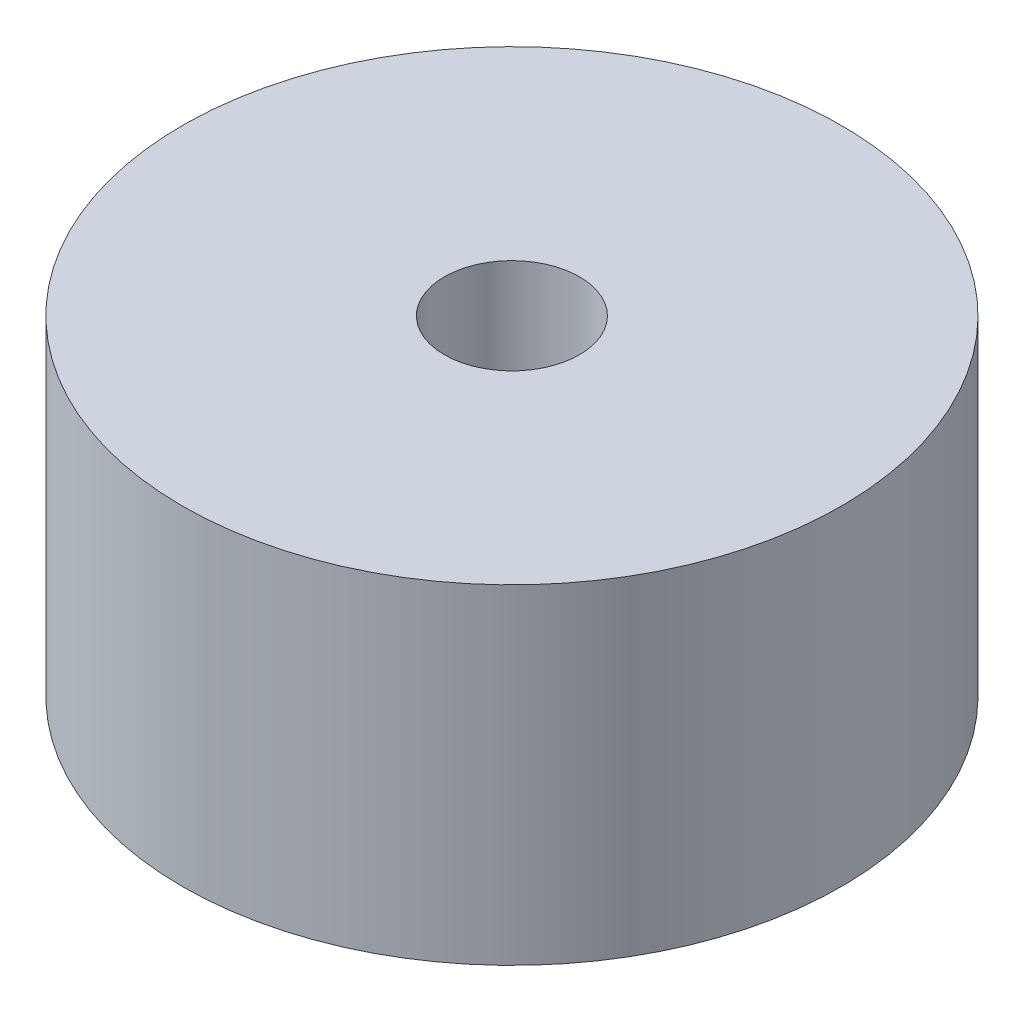
ISO-10303-21;
HEADER;
FILE_DESCRIPTION(('STEP AP214'),'2;1');
FILE_NAME('part.step','',(''),(''),'','','');
FILE_SCHEMA(('AUTOMOTIVE_DESIGN { 1 0 10303 214 1 1 1 1 }'));
ENDSEC;
DATA;
#1=APPLICATION_CONTEXT('core data for automotive mechanical design processes');
#2=APPLICATION_PROTOCOL_DEFINITION('international standard','automotive_design',2000,#1);
#3=PRODUCT_CONTEXT('',#1,'mechanical');
#4=PRODUCT('Part','Part','',(#3));
#5=PRODUCT_RELATED_PRODUCT_CATEGORY('part','',(#4));
#6=PRODUCT_DEFINITION_FORMATION('','',#4);
#7=PRODUCT_DEFINITION_CONTEXT('part definition',#1,'design');
#8=PRODUCT_DEFINITION('design','',#6,#7);
#9=PRODUCT_DEFINITION_SHAPE('','',#8);
#10=(LENGTH_UNIT() NAMED_UNIT(*) SI_UNIT(.MILLI.,.METRE.));
#11=(NAMED_UNIT(*) PLANE_ANGLE_UNIT() SI_UNIT($,.RADIAN.));
#12=(NAMED_UNIT(*) SI_UNIT($,.STERADIAN.) SOLID_ANGLE_UNIT());
#13=UNCERTAINTY_MEASURE_WITH_UNIT(LENGTH_MEASURE(1.E-05),#10,'distance_accuracy_value','');
#14=(GEOMETRIC_REPRESENTATION_CONTEXT(3) GLOBAL_UNCERTAINTY_ASSIGNED_CONTEXT((#13)) GLOBAL_UNIT_ASSIGNED_CONTEXT((#10,
#11,#12)) REPRESENTATION_CONTEXT('',''));
#15=CARTESIAN_POINT('',(0.,0.,0.));
#16=DIRECTION('',(0.,0.,1.));
#17=DIRECTION('',(1.,0.,0.));
#18=AXIS2_PLACEMENT_3D('',#15,#16,#17);
#19=CARTESIAN_POINT('',(0.,5.,0.));
#20=DIRECTION('',(0.,-1.,0.));
#21=DIRECTION('',(0.,0.,-1.));
#22=AXIS2_PLACEMENT_3D('',#19,#20,#21);
#23=CYLINDRICAL_SURFACE('',#22,5.);
#24=CARTESIAN_POINT('',(0.,5.,0.));
#25=DIRECTION('',(0.,1.,0.));
#26=DIRECTION('',(0.,0.,1.));
#27=AXIS2_PLACEMENT_3D('',#24,#25,#26);
#28=CIRCLE('',#27,5.);
#29=CARTESIAN_POINT('',(0.,5.,5.));
#30=VERTEX_POINT('',#29);
#31=EDGE_CURVE('E10',#30,#30,#28,.T.);
#32=ORIENTED_EDGE('',*,*,#31,.F.);
#33=EDGE_LOOP('',(#32));
#34=FACE_BOUND('',#33,.T.);
#35=CARTESIAN_POINT('',(0.,0.,0.));
#36=DIRECTION('',(0.,1.,0.));
#37=DIRECTION('',(0.,0.,1.));
#38=AXIS2_PLACEMENT_3D('',#35,#36,#37);
#39=CIRCLE('',#38,5.);
#40=CARTESIAN_POINT('',(0.,0.,5.));
#41=VERTEX_POINT('',#40);
#42=EDGE_CURVE('E41',#41,#41,#39,.T.);
#43=ORIENTED_EDGE('',*,*,#42,.T.);
#44=EDGE_LOOP('',(#43));
#45=FACE_BOUND('',#44,.T.);
#46=ADVANCED_FACE('F38',(#34,#45),#23,.T.);
#47=CARTESIAN_POINT('',(0.,5.,0.));
#48=DIRECTION('',(0.,1.,0.));
#49=DIRECTION('',(0.,0.,1.));
#50=AXIS2_PLACEMENT_3D('',#47,#48,#49);
#51=PLANE('',#50);
#52=CARTESIAN_POINT('',(0.,5.,0.));
#53=DIRECTION('',(0.,1.,0.));
#54=DIRECTION('',(0.,0.,1.));
#55=AXIS2_PLACEMENT_3D('',#52,#53,#54);
#56=CIRCLE('',#55,1.02499999999999);
#57=CARTESIAN_POINT('',(0.,5.,1.02499999999999));
#58=VERTEX_POINT('',#57);
#59=EDGE_CURVE('E52',#58,#58,#56,.T.);
#60=ORIENTED_EDGE('',*,*,#59,.F.);
#61=EDGE_LOOP('',(#60));
#62=FACE_BOUND('',#61,.T.);
#63=ORIENTED_EDGE('',*,*,#31,.T.);
#64=EDGE_LOOP('',(#63));
#65=FACE_BOUND('',#64,.T.);
#66=ADVANCED_FACE('F59',(#62,#65),#51,.T.);
#67=CARTESIAN_POINT('',(0.,0.,0.));
#68=DIRECTION('',(0.,1.,0.));
#69=DIRECTION('',(0.,0.,1.));
#70=AXIS2_PLACEMENT_3D('',#67,#68,#69);
#71=PLANE('',#70);
#72=CARTESIAN_POINT('',(0.,0.,0.));
#73=DIRECTION('',(0.,1.,0.));
#74=DIRECTION('',(0.,0.,1.));
#75=AXIS2_PLACEMENT_3D('',#72,#73,#74);
#76=CIRCLE('',#75,1.02499999999999);
#77=CARTESIAN_POINT('',(0.,0.,1.02499999999999));
#78=VERTEX_POINT('',#77);
#79=EDGE_CURVE('E48',#78,#78,#76,.T.);
#80=ORIENTED_EDGE('',*,*,#79,.T.);
#81=EDGE_LOOP('',(#80));
#82=FACE_BOUND('',#81,.T.);
#83=ORIENTED_EDGE('',*,*,#42,.F.);
#84=EDGE_LOOP('',(#83));
#85=FACE_BOUND('',#84,.T.);
#86=ADVANCED_FACE('F61',(#82,#85),#71,.F.);
#87=CARTESIAN_POINT('',(0.,5.,0.));
#88=DIRECTION('',(0.,1.,0.));
#89=DIRECTION('',(0.,0.,1.));
#90=AXIS2_PLACEMENT_3D('',#87,#88,#89);
#91=CYLINDRICAL_SURFACE('',#90,1.02499999999999);
#92=ORIENTED_EDGE('',*,*,#59,.T.);
#93=EDGE_LOOP('',(#92));
#94=FACE_BOUND('',#93,.T.);
#95=ORIENTED_EDGE('',*,*,#79,.F.);
#96=EDGE_LOOP('',(#95));
#97=FACE_BOUND('',#96,.T.);
#98=ADVANCED_FACE('F56',(#94,#97),#91,.F.);
#99=CLOSED_SHELL('',(#46,#66,#86,#98));
#100=MANIFOLD_SOLID_BREP('B2',#99);
#101=ADVANCED_BREP_SHAPE_REPRESENTATION('',(#18,#100),#14);
#102=SHAPE_DEFINITION_REPRESENTATION(#9,#101);
ENDSEC;
END-ISO-10303-21;
